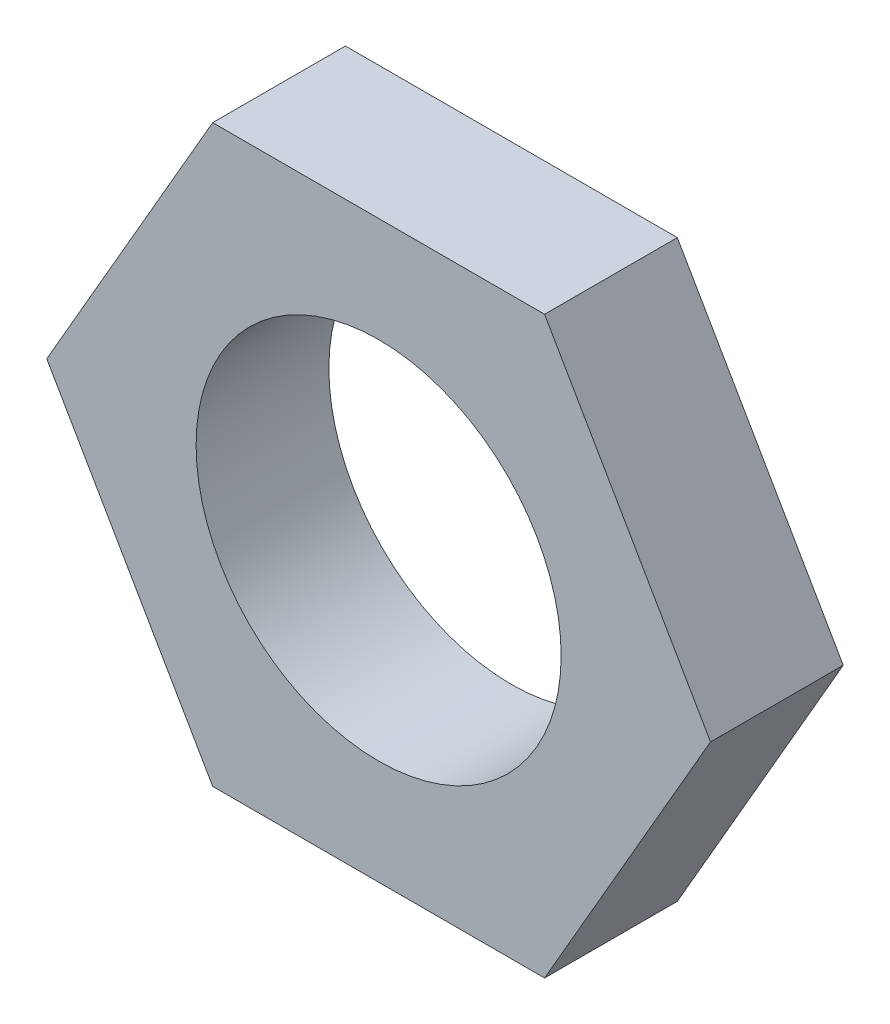
ISO-10303-21;
HEADER;
FILE_DESCRIPTION(('STEP AP214'),'2;1');
FILE_NAME('part.step','',(''),(''),'','','');
FILE_SCHEMA(('AUTOMOTIVE_DESIGN { 1 0 10303 214 1 1 1 1 }'));
ENDSEC;
DATA;
#1=APPLICATION_CONTEXT('core data for automotive mechanical design processes');
#2=APPLICATION_PROTOCOL_DEFINITION('international standard','automotive_design',2000,#1);
#3=PRODUCT_CONTEXT('',#1,'mechanical');
#4=PRODUCT('Part','Part','',(#3));
#5=PRODUCT_RELATED_PRODUCT_CATEGORY('part','',(#4));
#6=PRODUCT_DEFINITION_FORMATION('','',#4);
#7=PRODUCT_DEFINITION_CONTEXT('part definition',#1,'design');
#8=PRODUCT_DEFINITION('design','',#6,#7);
#9=PRODUCT_DEFINITION_SHAPE('','',#8);
#10=(LENGTH_UNIT() NAMED_UNIT(*) SI_UNIT(.MILLI.,.METRE.));
#11=(NAMED_UNIT(*) PLANE_ANGLE_UNIT() SI_UNIT($,.RADIAN.));
#12=(NAMED_UNIT(*) SI_UNIT($,.STERADIAN.) SOLID_ANGLE_UNIT());
#13=UNCERTAINTY_MEASURE_WITH_UNIT(LENGTH_MEASURE(1.E-05),#10,'distance_accuracy_value','');
#14=(GEOMETRIC_REPRESENTATION_CONTEXT(3) GLOBAL_UNCERTAINTY_ASSIGNED_CONTEXT((#13)) GLOBAL_UNIT_ASSIGNED_CONTEXT((#10,
#11,#12)) REPRESENTATION_CONTEXT('',''));
#15=CARTESIAN_POINT('',(0.,0.,0.));
#16=DIRECTION('',(0.,0.,1.));
#17=DIRECTION('',(1.,0.,0.));
#18=AXIS2_PLACEMENT_3D('',#15,#16,#17);
#19=CARTESIAN_POINT('',(-4.99999999999989,-2.77555756156289E-13,2.));
#20=DIRECTION('',(0.866025403784446,0.500000000000004,0.));
#21=DIRECTION('',(-0.500000000000004,0.866025403784446,0.));
#22=AXIS2_PLACEMENT_3D('',#19,#20,#21);
#23=PLANE('',#22);
#24=DIRECTION('',(0.500000000000004,-0.866025403784446,0.));
#25=VECTOR('',#24,1.);
#26=CARTESIAN_POINT('',(-4.99999999999989,-2.77555756156289E-13,0.));
#27=LINE('',#26,#25);
#28=CARTESIAN_POINT('',(-4.99999999999989,-2.77555756156289E-13,0.));
#29=VERTEX_POINT('',#28);
#30=CARTESIAN_POINT('',(-2.49999999999995,-4.33012701892205,0.));
#31=VERTEX_POINT('',#30);
#32=EDGE_CURVE('E139',#29,#31,#27,.T.);
#33=ORIENTED_EDGE('',*,*,#32,.T.);
#34=DIRECTION('',(0.,0.,-1.00000000000001));
#35=VECTOR('',#34,1.);
#36=CARTESIAN_POINT('',(-2.49999999999995,-4.33012701892205,2.));
#37=LINE('',#36,#35);
#38=CARTESIAN_POINT('',(-2.49999999999995,-4.33012701892205,2.));
#39=VERTEX_POINT('',#38);
#40=EDGE_CURVE('E11',#39,#31,#37,.T.);
#41=ORIENTED_EDGE('',*,*,#40,.F.);
#42=DIRECTION('',(0.500000000000004,-0.866025403784446,0.));
#43=VECTOR('',#42,1.);
#44=CARTESIAN_POINT('',(-4.99999999999989,-2.77555756156289E-13,2.));
#45=LINE('',#44,#43);
#46=CARTESIAN_POINT('',(-4.99999999999989,-2.77555756156289E-13,2.));
#47=VERTEX_POINT('',#46);
#48=EDGE_CURVE('E156',#47,#39,#45,.T.);
#49=ORIENTED_EDGE('',*,*,#48,.F.);
#50=DIRECTION('',(0.,0.,-1.00000000000001));
#51=VECTOR('',#50,1.);
#52=CARTESIAN_POINT('',(-4.99999999999989,-2.77555756156289E-13,2.));
#53=LINE('',#52,#51);
#54=EDGE_CURVE('E132',#47,#29,#53,.T.);
#55=ORIENTED_EDGE('',*,*,#54,.T.);
#56=EDGE_LOOP('',(#33,#41,#49,#55));
#57=FACE_BOUND('',#56,.T.);
#58=ADVANCED_FACE('F47',(#57),#23,.F.);
#59=CARTESIAN_POINT('',(-2.49999999999995,-4.33012701892205,2.));
#60=DIRECTION('',(0.,1.00000000000001,0.));
#61=DIRECTION('',(-1.00000000000001,0.,0.));
#62=AXIS2_PLACEMENT_3D('',#59,#60,#61);
#63=PLANE('',#62);
#64=DIRECTION('',(1.00000000000001,0.,0.));
#65=VECTOR('',#64,1.);
#66=CARTESIAN_POINT('',(-2.49999999999995,-4.33012701892205,0.));
#67=LINE('',#66,#65);
#68=CARTESIAN_POINT('',(2.49999999999995,-4.3301270189226,0.));
#69=VERTEX_POINT('',#68);
#70=EDGE_CURVE('E141',#31,#69,#67,.T.);
#71=ORIENTED_EDGE('',*,*,#70,.T.);
#72=DIRECTION('',(0.,0.,-1.00000000000001));
#73=VECTOR('',#72,1.);
#74=CARTESIAN_POINT('',(2.49999999999995,-4.3301270189226,2.));
#75=LINE('',#74,#73);
#76=CARTESIAN_POINT('',(2.49999999999995,-4.3301270189226,2.));
#77=VERTEX_POINT('',#76);
#78=EDGE_CURVE('E59',#77,#69,#75,.T.);
#79=ORIENTED_EDGE('',*,*,#78,.F.);
#80=DIRECTION('',(1.00000000000001,0.,0.));
#81=VECTOR('',#80,1.);
#82=CARTESIAN_POINT('',(-2.49999999999995,-4.33012701892205,2.));
#83=LINE('',#82,#81);
#84=EDGE_CURVE('E103',#39,#77,#83,.T.);
#85=ORIENTED_EDGE('',*,*,#84,.F.);
#86=ORIENTED_EDGE('',*,*,#40,.T.);
#87=EDGE_LOOP('',(#71,#79,#85,#86));
#88=FACE_BOUND('',#87,.T.);
#89=ADVANCED_FACE('F186',(#88),#63,.F.);
#90=CARTESIAN_POINT('',(2.49999999999995,-4.3301270189226,2.));
#91=DIRECTION('',(-0.866025403784445,0.500000000000005,0.));
#92=DIRECTION('',(-0.500000000000005,-0.866025403784446,0.));
#93=AXIS2_PLACEMENT_3D('',#90,#91,#92);
#94=PLANE('',#93);
#95=DIRECTION('',(0.500000000000005,0.866025403784445,0.));
#96=VECTOR('',#95,1.);
#97=CARTESIAN_POINT('',(2.49999999999995,-4.3301270189226,0.));
#98=LINE('',#97,#96);
#99=CARTESIAN_POINT('',(4.99999999999989,-1.77635683940025E-12,0.));
#100=VERTEX_POINT('',#99);
#101=EDGE_CURVE('E150',#69,#100,#98,.T.);
#102=ORIENTED_EDGE('',*,*,#101,.T.);
#103=DIRECTION('',(0.,0.,-1.00000000000001));
#104=VECTOR('',#103,1.);
#105=CARTESIAN_POINT('',(4.99999999999989,-1.77635683940025E-12,2.));
#106=LINE('',#105,#104);
#107=CARTESIAN_POINT('',(4.99999999999989,-1.77635683940025E-12,2.));
#108=VERTEX_POINT('',#107);
#109=EDGE_CURVE('E130',#108,#100,#106,.T.);
#110=ORIENTED_EDGE('',*,*,#109,.F.);
#111=DIRECTION('',(0.500000000000005,0.866025403784445,0.));
#112=VECTOR('',#111,1.);
#113=CARTESIAN_POINT('',(2.49999999999995,-4.3301270189226,2.));
#114=LINE('',#113,#112);
#115=EDGE_CURVE('E119',#77,#108,#114,.T.);
#116=ORIENTED_EDGE('',*,*,#115,.F.);
#117=ORIENTED_EDGE('',*,*,#78,.T.);
#118=EDGE_LOOP('',(#102,#110,#116,#117));
#119=FACE_BOUND('',#118,.T.);
#120=ADVANCED_FACE('F170',(#119),#94,.F.);
#121=CARTESIAN_POINT('',(4.99999999999989,-1.77635683940025E-12,2.));
#122=DIRECTION('',(-0.866025403784446,-0.500000000000003,0.));
#123=DIRECTION('',(0.500000000000003,-0.866025403784446,0.));
#124=AXIS2_PLACEMENT_3D('',#121,#122,#123);
#125=PLANE('',#124);
#126=DIRECTION('',(-0.500000000000004,0.866025403784445,0.));
#127=VECTOR('',#126,1.);
#128=CARTESIAN_POINT('',(4.99999999999989,-1.77635683940025E-12,0.));
#129=LINE('',#128,#127);
#130=CARTESIAN_POINT('',(2.5000000000015,4.33012701892077,0.));
#131=VERTEX_POINT('',#130);
#132=EDGE_CURVE('E122',#100,#131,#129,.T.);
#133=ORIENTED_EDGE('',*,*,#132,.T.);
#134=DIRECTION('',(0.,0.,-1.00000000000001));
#135=VECTOR('',#134,1.);
#136=CARTESIAN_POINT('',(2.5000000000015,4.33012701892077,2.));
#137=LINE('',#136,#135);
#138=CARTESIAN_POINT('',(2.5000000000015,4.33012701892077,2.));
#139=VERTEX_POINT('',#138);
#140=EDGE_CURVE('E125',#139,#131,#137,.T.);
#141=ORIENTED_EDGE('',*,*,#140,.F.);
#142=DIRECTION('',(-0.500000000000004,0.866025403784445,0.));
#143=VECTOR('',#142,1.);
#144=CARTESIAN_POINT('',(4.99999999999989,-1.77635683940025E-12,2.));
#145=LINE('',#144,#143);
#146=EDGE_CURVE('E109',#108,#139,#145,.T.);
#147=ORIENTED_EDGE('',*,*,#146,.F.);
#148=ORIENTED_EDGE('',*,*,#109,.T.);
#149=EDGE_LOOP('',(#133,#141,#147,#148));
#150=FACE_BOUND('',#149,.T.);
#151=ADVANCED_FACE('F121',(#150),#125,.F.);
#152=CARTESIAN_POINT('',(2.5000000000015,4.33012701892077,2.));
#153=DIRECTION('',(0.,-1.00000000000001,0.));
#154=DIRECTION('',(1.00000000000001,0.,0.));
#155=AXIS2_PLACEMENT_3D('',#152,#153,#154);
#156=PLANE('',#155);
#157=DIRECTION('',(-1.00000000000001,0.,0.));
#158=VECTOR('',#157,1.);
#159=CARTESIAN_POINT('',(2.5000000000015,4.33012701892077,0.));
#160=LINE('',#159,#158);
#161=CARTESIAN_POINT('',(-2.4999999999995,4.33012701892238,0.));
#162=VERTEX_POINT('',#161);
#163=EDGE_CURVE('E90',#131,#162,#160,.T.);
#164=ORIENTED_EDGE('',*,*,#163,.T.);
#165=DIRECTION('',(0.,0.,-1.00000000000001));
#166=VECTOR('',#165,1.);
#167=CARTESIAN_POINT('',(-2.4999999999995,4.33012701892238,2.));
#168=LINE('',#167,#166);
#169=CARTESIAN_POINT('',(-2.4999999999995,4.33012701892238,2.));
#170=VERTEX_POINT('',#169);
#171=EDGE_CURVE('E126',#170,#162,#168,.T.);
#172=ORIENTED_EDGE('',*,*,#171,.F.);
#173=DIRECTION('',(-1.00000000000001,0.,0.));
#174=VECTOR('',#173,1.);
#175=CARTESIAN_POINT('',(2.5000000000015,4.33012701892077,2.));
#176=LINE('',#175,#174);
#177=EDGE_CURVE('E111',#139,#170,#176,.T.);
#178=ORIENTED_EDGE('',*,*,#177,.F.);
#179=ORIENTED_EDGE('',*,*,#140,.T.);
#180=EDGE_LOOP('',(#164,#172,#178,#179));
#181=FACE_BOUND('',#180,.T.);
#182=ADVANCED_FACE('F128',(#181),#156,.F.);
#183=CARTESIAN_POINT('',(-2.4999999999995,4.33012701892238,2.));
#184=DIRECTION('',(0.866025403784445,-0.500000000000006,0.));
#185=DIRECTION('',(0.500000000000006,0.866025403784445,0.));
#186=AXIS2_PLACEMENT_3D('',#183,#184,#185);
#187=PLANE('',#186);
#188=DIRECTION('',(-0.500000000000006,-0.866025403784445,0.));
#189=VECTOR('',#188,1.);
#190=CARTESIAN_POINT('',(-2.4999999999995,4.33012701892238,0.));
#191=LINE('',#190,#189);
#192=EDGE_CURVE('E92',#162,#29,#191,.T.);
#193=ORIENTED_EDGE('',*,*,#192,.T.);
#194=ORIENTED_EDGE('',*,*,#54,.F.);
#195=DIRECTION('',(-0.500000000000006,-0.866025403784445,0.));
#196=VECTOR('',#195,1.);
#197=CARTESIAN_POINT('',(-2.4999999999995,4.33012701892238,2.));
#198=LINE('',#197,#196);
#199=EDGE_CURVE('E68',#170,#47,#198,.T.);
#200=ORIENTED_EDGE('',*,*,#199,.F.);
#201=ORIENTED_EDGE('',*,*,#171,.T.);
#202=EDGE_LOOP('',(#193,#194,#200,#201));
#203=FACE_BOUND('',#202,.T.);
#204=ADVANCED_FACE('F173',(#203),#187,.F.);
#205=CARTESIAN_POINT('',(0.,0.,2.));
#206=DIRECTION('',(0.,0.,1.00000000000001));
#207=DIRECTION('',(1.00000000000001,0.,0.));
#208=AXIS2_PLACEMENT_3D('',#205,#206,#207);
#209=PLANE('',#208);
#210=CARTESIAN_POINT('',(0.,0.,2.));
#211=DIRECTION('',(0.,0.,-1.00000000000001));
#212=DIRECTION('',(-1.00000000000001,0.,0.));
#213=AXIS2_PLACEMENT_3D('',#210,#211,#212);
#214=CIRCLE('',#213,2.75);
#215=CARTESIAN_POINT('',(-2.75000000000002,0.,2.));
#216=VERTEX_POINT('',#215);
#217=EDGE_CURVE('E145',#216,#216,#214,.T.);
#218=ORIENTED_EDGE('',*,*,#217,.T.);
#219=EDGE_LOOP('',(#218));
#220=FACE_BOUND('',#219,.T.);
#221=ORIENTED_EDGE('',*,*,#48,.T.);
#222=ORIENTED_EDGE('',*,*,#84,.T.);
#223=ORIENTED_EDGE('',*,*,#115,.T.);
#224=ORIENTED_EDGE('',*,*,#146,.T.);
#225=ORIENTED_EDGE('',*,*,#177,.T.);
#226=ORIENTED_EDGE('',*,*,#199,.T.);
#227=EDGE_LOOP('',(#221,#222,#223,#224,#225,#226));
#228=FACE_BOUND('',#227,.T.);
#229=ADVANCED_FACE('F115',(#220,#228),#209,.T.);
#230=CARTESIAN_POINT('',(0.,0.,0.));
#231=DIRECTION('',(0.,0.,1.00000000000001));
#232=DIRECTION('',(1.00000000000001,0.,0.));
#233=AXIS2_PLACEMENT_3D('',#230,#231,#232);
#234=PLANE('',#233);
#235=CARTESIAN_POINT('',(0.,0.,0.));
#236=DIRECTION('',(0.,0.,-1.00000000000001));
#237=DIRECTION('',(-1.00000000000001,0.,0.));
#238=AXIS2_PLACEMENT_3D('',#235,#236,#237);
#239=CIRCLE('',#238,2.75);
#240=CARTESIAN_POINT('',(-2.75000000000002,0.,0.));
#241=VERTEX_POINT('',#240);
#242=EDGE_CURVE('E234',#241,#241,#239,.T.);
#243=ORIENTED_EDGE('',*,*,#242,.F.);
#244=EDGE_LOOP('',(#243));
#245=FACE_BOUND('',#244,.T.);
#246=ORIENTED_EDGE('',*,*,#32,.F.);
#247=ORIENTED_EDGE('',*,*,#192,.F.);
#248=ORIENTED_EDGE('',*,*,#163,.F.);
#249=ORIENTED_EDGE('',*,*,#132,.F.);
#250=ORIENTED_EDGE('',*,*,#101,.F.);
#251=ORIENTED_EDGE('',*,*,#70,.F.);
#252=EDGE_LOOP('',(#246,#247,#248,#249,#250,#251));
#253=FACE_BOUND('',#252,.T.);
#254=ADVANCED_FACE('F168',(#245,#253),#234,.F.);
#255=CARTESIAN_POINT('',(0.,0.,2.));
#256=DIRECTION('',(0.,0.,-1.00000000000001));
#257=DIRECTION('',(-1.00000000000001,0.,0.));
#258=AXIS2_PLACEMENT_3D('',#255,#256,#257);
#259=CYLINDRICAL_SURFACE('',#258,2.75);
#260=ORIENTED_EDGE('',*,*,#217,.F.);
#261=EDGE_LOOP('',(#260));
#262=FACE_BOUND('',#261,.T.);
#263=ORIENTED_EDGE('',*,*,#242,.T.);
#264=EDGE_LOOP('',(#263));
#265=FACE_BOUND('',#264,.T.);
#266=ADVANCED_FACE('F218',(#262,#265),#259,.F.);
#267=CLOSED_SHELL('',(#58,#89,#120,#151,#182,#204,#229,#254,#266));
#268=MANIFOLD_SOLID_BREP('B2',#267);
#269=ADVANCED_BREP_SHAPE_REPRESENTATION('',(#18,#268),#14);
#270=SHAPE_DEFINITION_REPRESENTATION(#9,#269);
ENDSEC;
END-ISO-10303-21;
